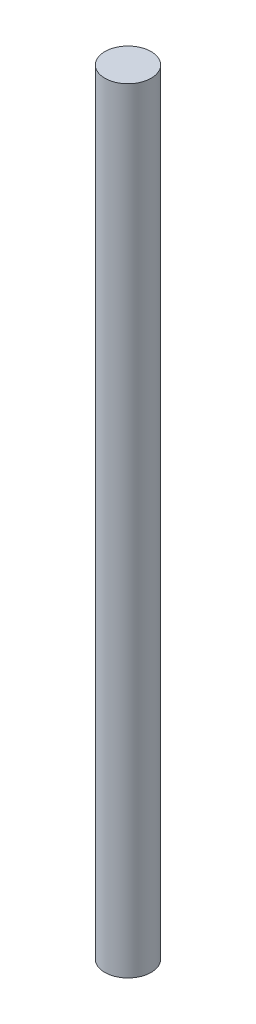
ISO-10303-21;
HEADER;
FILE_DESCRIPTION(('STEP AP214'),'2;1');
FILE_NAME('part.step','',(''),(''),'','','');
FILE_SCHEMA(('AUTOMOTIVE_DESIGN { 1 0 10303 214 1 1 1 1 }'));
ENDSEC;
DATA;
#1=APPLICATION_CONTEXT('core data for automotive mechanical design processes');
#2=APPLICATION_PROTOCOL_DEFINITION('international standard','automotive_design',2000,#1);
#3=PRODUCT_CONTEXT('',#1,'mechanical');
#4=PRODUCT('Part','Part','',(#3));
#5=PRODUCT_RELATED_PRODUCT_CATEGORY('part','',(#4));
#6=PRODUCT_DEFINITION_FORMATION('','',#4);
#7=PRODUCT_DEFINITION_CONTEXT('part definition',#1,'design');
#8=PRODUCT_DEFINITION('design','',#6,#7);
#9=PRODUCT_DEFINITION_SHAPE('','',#8);
#10=(LENGTH_UNIT() NAMED_UNIT(*) SI_UNIT(.MILLI.,.METRE.));
#11=(NAMED_UNIT(*) PLANE_ANGLE_UNIT() SI_UNIT($,.RADIAN.));
#12=(NAMED_UNIT(*) SI_UNIT($,.STERADIAN.) SOLID_ANGLE_UNIT());
#13=UNCERTAINTY_MEASURE_WITH_UNIT(LENGTH_MEASURE(1.E-05),#10,'distance_accuracy_value','');
#14=(GEOMETRIC_REPRESENTATION_CONTEXT(3) GLOBAL_UNCERTAINTY_ASSIGNED_CONTEXT((#13)) GLOBAL_UNIT_ASSIGNED_CONTEXT((#10,
#11,#12)) REPRESENTATION_CONTEXT('',''));
#15=CARTESIAN_POINT('',(0.,0.,0.));
#16=DIRECTION('',(0.,0.,1.));
#17=DIRECTION('',(1.,0.,0.));
#18=AXIS2_PLACEMENT_3D('',#15,#16,#17);
#19=CARTESIAN_POINT('',(0.,0.,0.));
#20=DIRECTION('',(0.,1.,0.));
#21=DIRECTION('',(0.,0.,1.));
#22=AXIS2_PLACEMENT_3D('',#19,#20,#21);
#23=PLANE('',#22);
#24=CARTESIAN_POINT('',(0.,0.,0.));
#25=DIRECTION('',(0.,1.,0.));
#26=DIRECTION('',(0.,0.,1.));
#27=AXIS2_PLACEMENT_3D('',#24,#25,#26);
#28=CIRCLE('',#27,3.);
#29=CARTESIAN_POINT('',(0.,0.,3.));
#30=VERTEX_POINT('',#29);
#31=EDGE_CURVE('E50',#30,#30,#28,.T.);
#32=ORIENTED_EDGE('',*,*,#31,.F.);
#33=EDGE_LOOP('',(#32));
#34=FACE_BOUND('',#33,.T.);
#35=ADVANCED_FACE('F43',(#34),#23,.F.);
#36=CARTESIAN_POINT('',(0.,100.443459654371,0.));
#37=DIRECTION('',(0.,1.,0.));
#38=DIRECTION('',(0.,0.,1.));
#39=AXIS2_PLACEMENT_3D('',#36,#37,#38);
#40=PLANE('',#39);
#41=CARTESIAN_POINT('',(0.,100.443459654371,0.));
#42=DIRECTION('',(0.,1.,0.));
#43=DIRECTION('',(0.,0.,1.));
#44=AXIS2_PLACEMENT_3D('',#41,#42,#43);
#45=CIRCLE('',#44,3.);
#46=CARTESIAN_POINT('',(0.,100.443459654371,3.));
#47=VERTEX_POINT('',#46);
#48=EDGE_CURVE('E13',#47,#47,#45,.T.);
#49=ORIENTED_EDGE('',*,*,#48,.T.);
#50=EDGE_LOOP('',(#49));
#51=FACE_BOUND('',#50,.T.);
#52=ADVANCED_FACE('F57',(#51),#40,.T.);
#53=CARTESIAN_POINT('',(0.,0.,0.));
#54=DIRECTION('',(0.,1.,0.));
#55=DIRECTION('',(0.,0.,1.));
#56=AXIS2_PLACEMENT_3D('',#53,#54,#55);
#57=CYLINDRICAL_SURFACE('',#56,3.);
#58=ORIENTED_EDGE('',*,*,#48,.F.);
#59=EDGE_LOOP('',(#58));
#60=FACE_BOUND('',#59,.T.);
#61=ORIENTED_EDGE('',*,*,#31,.T.);
#62=EDGE_LOOP('',(#61));
#63=FACE_BOUND('',#62,.T.);
#64=ADVANCED_FACE('F59',(#60,#63),#57,.T.);
#65=CLOSED_SHELL('',(#35,#52,#64));
#66=MANIFOLD_SOLID_BREP('B2',#65);
#67=ADVANCED_BREP_SHAPE_REPRESENTATION('',(#18,#66),#14);
#68=SHAPE_DEFINITION_REPRESENTATION(#9,#67);
ENDSEC;
END-ISO-10303-21;
